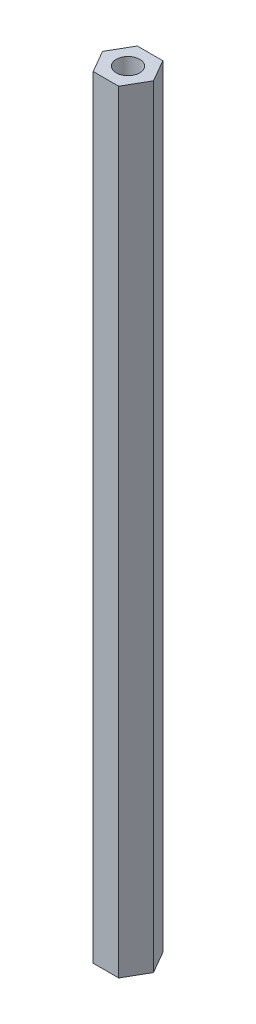
ISO-10303-21;
HEADER;
FILE_DESCRIPTION(('STEP AP214'),'2;1');
FILE_NAME('part.step','',(''),(''),'','','');
FILE_SCHEMA(('AUTOMOTIVE_DESIGN { 1 0 10303 214 1 1 1 1 }'));
ENDSEC;
DATA;
#1=APPLICATION_CONTEXT('core data for automotive mechanical design processes');
#2=APPLICATION_PROTOCOL_DEFINITION('international standard','automotive_design',2000,#1);
#3=PRODUCT_CONTEXT('',#1,'mechanical');
#4=PRODUCT('Part','Part','',(#3));
#5=PRODUCT_RELATED_PRODUCT_CATEGORY('part','',(#4));
#6=PRODUCT_DEFINITION_FORMATION('','',#4);
#7=PRODUCT_DEFINITION_CONTEXT('part definition',#1,'design');
#8=PRODUCT_DEFINITION('design','',#6,#7);
#9=PRODUCT_DEFINITION_SHAPE('','',#8);
#10=(LENGTH_UNIT() NAMED_UNIT(*) SI_UNIT(.MILLI.,.METRE.));
#11=(NAMED_UNIT(*) PLANE_ANGLE_UNIT() SI_UNIT($,.RADIAN.));
#12=(NAMED_UNIT(*) SI_UNIT($,.STERADIAN.) SOLID_ANGLE_UNIT());
#13=UNCERTAINTY_MEASURE_WITH_UNIT(LENGTH_MEASURE(1.E-05),#10,'distance_accuracy_value','');
#14=(GEOMETRIC_REPRESENTATION_CONTEXT(3) GLOBAL_UNCERTAINTY_ASSIGNED_CONTEXT((#13)) GLOBAL_UNIT_ASSIGNED_CONTEXT((#10,
#11,#12)) REPRESENTATION_CONTEXT('',''));
#15=CARTESIAN_POINT('',(0.,0.,0.));
#16=DIRECTION('',(0.,0.,1.));
#17=DIRECTION('',(1.,0.,0.));
#18=AXIS2_PLACEMENT_3D('',#15,#16,#17);
#19=CARTESIAN_POINT('',(0.,105.,0.));
#20=DIRECTION('',(0.,1.,0.));
#21=DIRECTION('',(0.,0.,1.));
#22=AXIS2_PLACEMENT_3D('',#19,#20,#21);
#23=PLANE('',#22);
#24=DIRECTION('',(0.5,0.,-0.866025403784439));
#25=VECTOR('',#24,1.);
#26=CARTESIAN_POINT('',(1.73205080756888,105.,3.));
#27=LINE('',#26,#25);
#28=CARTESIAN_POINT('',(1.73205080756888,105.,3.));
#29=VERTEX_POINT('',#28);
#30=CARTESIAN_POINT('',(3.46410161513775,105.,0.));
#31=VERTEX_POINT('',#30);
#32=EDGE_CURVE('E150',#29,#31,#27,.T.);
#33=ORIENTED_EDGE('',*,*,#32,.T.);
#34=DIRECTION('',(-0.500000000000001,0.,-0.866025403784438));
#35=VECTOR('',#34,1.);
#36=CARTESIAN_POINT('',(3.46410161513775,105.,0.));
#37=LINE('',#36,#35);
#38=CARTESIAN_POINT('',(1.73205080756888,105.,-3.));
#39=VERTEX_POINT('',#38);
#40=EDGE_CURVE('E98',#31,#39,#37,.T.);
#41=ORIENTED_EDGE('',*,*,#40,.T.);
#42=DIRECTION('',(-1.,0.,0.));
#43=VECTOR('',#42,1.);
#44=CARTESIAN_POINT('',(1.73205080756888,105.,-3.));
#45=LINE('',#44,#43);
#46=CARTESIAN_POINT('',(-1.73205080756888,105.,-3.));
#47=VERTEX_POINT('',#46);
#48=EDGE_CURVE('E111',#39,#47,#45,.T.);
#49=ORIENTED_EDGE('',*,*,#48,.T.);
#50=DIRECTION('',(-0.5,0.,0.866025403784439));
#51=VECTOR('',#50,1.);
#52=CARTESIAN_POINT('',(-1.73205080756888,105.,-3.));
#53=LINE('',#52,#51);
#54=CARTESIAN_POINT('',(-3.46410161513775,105.,0.));
#55=VERTEX_POINT('',#54);
#56=EDGE_CURVE('E105',#47,#55,#53,.T.);
#57=ORIENTED_EDGE('',*,*,#56,.T.);
#58=DIRECTION('',(0.5,0.,0.866025403784438));
#59=VECTOR('',#58,1.);
#60=CARTESIAN_POINT('',(-3.46410161513775,105.,0.));
#61=LINE('',#60,#59);
#62=CARTESIAN_POINT('',(-1.73205080756888,105.,3.));
#63=VERTEX_POINT('',#62);
#64=EDGE_CURVE('E109',#55,#63,#61,.T.);
#65=ORIENTED_EDGE('',*,*,#64,.T.);
#66=DIRECTION('',(1.,0.,0.));
#67=VECTOR('',#66,1.);
#68=CARTESIAN_POINT('',(-1.73205080756888,105.,3.));
#69=LINE('',#68,#67);
#70=EDGE_CURVE('E61',#63,#29,#69,.T.);
#71=ORIENTED_EDGE('',*,*,#70,.T.);
#72=EDGE_LOOP('',(#33,#41,#49,#57,#65,#71));
#73=FACE_BOUND('',#72,.T.);
#74=CARTESIAN_POINT('',(0.,105.,0.));
#75=DIRECTION('',(0.,1.,0.));
#76=DIRECTION('',(0.,0.,1.));
#77=AXIS2_PLACEMENT_3D('',#74,#75,#76);
#78=CIRCLE('',#77,1.6);
#79=CARTESIAN_POINT('',(0.,105.,1.6));
#80=VERTEX_POINT('',#79);
#81=EDGE_CURVE('E138',#80,#80,#78,.T.);
#82=ORIENTED_EDGE('',*,*,#81,.F.);
#83=EDGE_LOOP('',(#82));
#84=FACE_BOUND('',#83,.T.);
#85=ADVANCED_FACE('F43',(#73,#84),#23,.T.);
#86=CARTESIAN_POINT('',(0.,0.,0.));
#87=DIRECTION('',(0.,1.,0.));
#88=DIRECTION('',(0.,0.,1.));
#89=AXIS2_PLACEMENT_3D('',#86,#87,#88);
#90=PLANE('',#89);
#91=DIRECTION('',(0.5,0.,-0.866025403784439));
#92=VECTOR('',#91,1.);
#93=CARTESIAN_POINT('',(1.73205080756888,0.,3.));
#94=LINE('',#93,#92);
#95=CARTESIAN_POINT('',(1.73205080756888,0.,3.));
#96=VERTEX_POINT('',#95);
#97=CARTESIAN_POINT('',(3.46410161513775,0.,0.));
#98=VERTEX_POINT('',#97);
#99=EDGE_CURVE('E133',#96,#98,#94,.T.);
#100=ORIENTED_EDGE('',*,*,#99,.F.);
#101=DIRECTION('',(1.,0.,0.));
#102=VECTOR('',#101,1.);
#103=CARTESIAN_POINT('',(-1.73205080756888,0.,3.));
#104=LINE('',#103,#102);
#105=CARTESIAN_POINT('',(-1.73205080756888,0.,3.));
#106=VERTEX_POINT('',#105);
#107=EDGE_CURVE('E90',#106,#96,#104,.T.);
#108=ORIENTED_EDGE('',*,*,#107,.F.);
#109=DIRECTION('',(0.5,0.,0.866025403784438));
#110=VECTOR('',#109,1.);
#111=CARTESIAN_POINT('',(-3.46410161513775,0.,0.));
#112=LINE('',#111,#110);
#113=CARTESIAN_POINT('',(-3.46410161513775,0.,0.));
#114=VERTEX_POINT('',#113);
#115=EDGE_CURVE('E84',#114,#106,#112,.T.);
#116=ORIENTED_EDGE('',*,*,#115,.F.);
#117=DIRECTION('',(-0.5,0.,0.866025403784439));
#118=VECTOR('',#117,1.);
#119=CARTESIAN_POINT('',(-1.73205080756888,0.,-3.));
#120=LINE('',#119,#118);
#121=CARTESIAN_POINT('',(-1.73205080756888,0.,-3.));
#122=VERTEX_POINT('',#121);
#123=EDGE_CURVE('E120',#122,#114,#120,.T.);
#124=ORIENTED_EDGE('',*,*,#123,.F.);
#125=DIRECTION('',(-1.,0.,0.));
#126=VECTOR('',#125,1.);
#127=CARTESIAN_POINT('',(1.73205080756888,0.,-3.));
#128=LINE('',#127,#126);
#129=CARTESIAN_POINT('',(1.73205080756888,0.,-3.));
#130=VERTEX_POINT('',#129);
#131=EDGE_CURVE('E141',#130,#122,#128,.T.);
#132=ORIENTED_EDGE('',*,*,#131,.F.);
#133=DIRECTION('',(-0.500000000000001,0.,-0.866025403784438));
#134=VECTOR('',#133,1.);
#135=CARTESIAN_POINT('',(3.46410161513775,0.,0.));
#136=LINE('',#135,#134);
#137=EDGE_CURVE('E137',#98,#130,#136,.T.);
#138=ORIENTED_EDGE('',*,*,#137,.F.);
#139=EDGE_LOOP('',(#100,#108,#116,#124,#132,#138));
#140=FACE_BOUND('',#139,.T.);
#141=CARTESIAN_POINT('',(0.,0.,0.));
#142=DIRECTION('',(0.,1.,0.));
#143=DIRECTION('',(0.,0.,1.));
#144=AXIS2_PLACEMENT_3D('',#141,#142,#143);
#145=CIRCLE('',#144,1.6);
#146=CARTESIAN_POINT('',(0.,0.,1.6));
#147=VERTEX_POINT('',#146);
#148=EDGE_CURVE('E251',#147,#147,#145,.T.);
#149=ORIENTED_EDGE('',*,*,#148,.T.);
#150=EDGE_LOOP('',(#149));
#151=FACE_BOUND('',#150,.T.);
#152=ADVANCED_FACE('F163',(#140,#151),#90,.F.);
#153=CARTESIAN_POINT('',(1.73205080756888,105.,3.));
#154=DIRECTION('',(-0.866025403784439,0.,-0.5));
#155=DIRECTION('',(-0.5,0.,0.866025403784438));
#156=AXIS2_PLACEMENT_3D('',#153,#154,#155);
#157=PLANE('',#156);
#158=ORIENTED_EDGE('',*,*,#99,.T.);
#159=DIRECTION('',(0.,-1.,0.));
#160=VECTOR('',#159,1.);
#161=CARTESIAN_POINT('',(3.46410161513775,105.,0.));
#162=LINE('',#161,#160);
#163=EDGE_CURVE('E11',#31,#98,#162,.T.);
#164=ORIENTED_EDGE('',*,*,#163,.F.);
#165=ORIENTED_EDGE('',*,*,#32,.F.);
#166=DIRECTION('',(0.,-1.,0.));
#167=VECTOR('',#166,1.);
#168=CARTESIAN_POINT('',(1.73205080756888,105.,3.));
#169=LINE('',#168,#167);
#170=EDGE_CURVE('E129',#29,#96,#169,.T.);
#171=ORIENTED_EDGE('',*,*,#170,.T.);
#172=EDGE_LOOP('',(#158,#164,#165,#171));
#173=FACE_BOUND('',#172,.T.);
#174=ADVANCED_FACE('F45',(#173),#157,.F.);
#175=CARTESIAN_POINT('',(3.46410161513775,105.,0.));
#176=DIRECTION('',(-0.866025403784438,0.,0.500000000000001));
#177=DIRECTION('',(0.500000000000001,0.,0.866025403784438));
#178=AXIS2_PLACEMENT_3D('',#175,#176,#177);
#179=PLANE('',#178);
#180=ORIENTED_EDGE('',*,*,#137,.T.);
#181=DIRECTION('',(0.,-1.,0.));
#182=VECTOR('',#181,1.);
#183=CARTESIAN_POINT('',(1.73205080756888,105.,-3.));
#184=LINE('',#183,#182);
#185=EDGE_CURVE('E53',#39,#130,#184,.T.);
#186=ORIENTED_EDGE('',*,*,#185,.F.);
#187=ORIENTED_EDGE('',*,*,#40,.F.);
#188=ORIENTED_EDGE('',*,*,#163,.T.);
#189=EDGE_LOOP('',(#180,#186,#187,#188));
#190=FACE_BOUND('',#189,.T.);
#191=ADVANCED_FACE('F188',(#190),#179,.F.);
#192=CARTESIAN_POINT('',(1.73205080756888,105.,-3.));
#193=DIRECTION('',(0.,0.,1.));
#194=DIRECTION('',(1.,0.,0.));
#195=AXIS2_PLACEMENT_3D('',#192,#193,#194);
#196=PLANE('',#195);
#197=ORIENTED_EDGE('',*,*,#131,.T.);
#198=DIRECTION('',(0.,-1.,0.));
#199=VECTOR('',#198,1.);
#200=CARTESIAN_POINT('',(-1.73205080756888,105.,-3.));
#201=LINE('',#200,#199);
#202=EDGE_CURVE('E122',#47,#122,#201,.T.);
#203=ORIENTED_EDGE('',*,*,#202,.F.);
#204=ORIENTED_EDGE('',*,*,#48,.F.);
#205=ORIENTED_EDGE('',*,*,#185,.T.);
#206=EDGE_LOOP('',(#197,#203,#204,#205));
#207=FACE_BOUND('',#206,.T.);
#208=ADVANCED_FACE('F160',(#207),#196,.F.);
#209=CARTESIAN_POINT('',(-1.73205080756888,105.,-3.));
#210=DIRECTION('',(0.866025403784439,0.,0.5));
#211=DIRECTION('',(0.5,0.,-0.866025403784439));
#212=AXIS2_PLACEMENT_3D('',#209,#210,#211);
#213=PLANE('',#212);
#214=ORIENTED_EDGE('',*,*,#123,.T.);
#215=DIRECTION('',(0.,-1.,0.));
#216=VECTOR('',#215,1.);
#217=CARTESIAN_POINT('',(-3.46410161513775,105.,0.));
#218=LINE('',#217,#216);
#219=EDGE_CURVE('E117',#55,#114,#218,.T.);
#220=ORIENTED_EDGE('',*,*,#219,.F.);
#221=ORIENTED_EDGE('',*,*,#56,.F.);
#222=ORIENTED_EDGE('',*,*,#202,.T.);
#223=EDGE_LOOP('',(#214,#220,#221,#222));
#224=FACE_BOUND('',#223,.T.);
#225=ADVANCED_FACE('F118',(#224),#213,.F.);
#226=CARTESIAN_POINT('',(-3.46410161513775,105.,0.));
#227=DIRECTION('',(0.866025403784439,0.,-0.5));
#228=DIRECTION('',(-0.5,0.,-0.866025403784439));
#229=AXIS2_PLACEMENT_3D('',#226,#227,#228);
#230=PLANE('',#229);
#231=ORIENTED_EDGE('',*,*,#115,.T.);
#232=DIRECTION('',(0.,-1.,0.));
#233=VECTOR('',#232,1.);
#234=CARTESIAN_POINT('',(-1.73205080756888,105.,3.));
#235=LINE('',#234,#233);
#236=EDGE_CURVE('E123',#63,#106,#235,.T.);
#237=ORIENTED_EDGE('',*,*,#236,.F.);
#238=ORIENTED_EDGE('',*,*,#64,.F.);
#239=ORIENTED_EDGE('',*,*,#219,.T.);
#240=EDGE_LOOP('',(#231,#237,#238,#239));
#241=FACE_BOUND('',#240,.T.);
#242=ADVANCED_FACE('F125',(#241),#230,.F.);
#243=CARTESIAN_POINT('',(-1.73205080756888,105.,3.));
#244=DIRECTION('',(0.,0.,-1.));
#245=DIRECTION('',(-1.,0.,0.));
#246=AXIS2_PLACEMENT_3D('',#243,#244,#245);
#247=PLANE('',#246);
#248=ORIENTED_EDGE('',*,*,#107,.T.);
#249=ORIENTED_EDGE('',*,*,#170,.F.);
#250=ORIENTED_EDGE('',*,*,#70,.F.);
#251=ORIENTED_EDGE('',*,*,#236,.T.);
#252=EDGE_LOOP('',(#248,#249,#250,#251));
#253=FACE_BOUND('',#252,.T.);
#254=ADVANCED_FACE('F168',(#253),#247,.F.);
#255=CARTESIAN_POINT('',(0.,105.,0.));
#256=DIRECTION('',(0.,-1.,0.));
#257=DIRECTION('',(0.,0.,-1.));
#258=AXIS2_PLACEMENT_3D('',#255,#256,#257);
#259=CYLINDRICAL_SURFACE('',#258,1.6);
#260=ORIENTED_EDGE('',*,*,#81,.T.);
#261=EDGE_LOOP('',(#260));
#262=FACE_BOUND('',#261,.T.);
#263=ORIENTED_EDGE('',*,*,#148,.F.);
#264=EDGE_LOOP('',(#263));
#265=FACE_BOUND('',#264,.T.);
#266=ADVANCED_FACE('F170',(#262,#265),#259,.F.);
#267=CLOSED_SHELL('',(#85,#152,#174,#191,#208,#225,#242,#254,#266));
#268=MANIFOLD_SOLID_BREP('B2',#267);
#269=ADVANCED_BREP_SHAPE_REPRESENTATION('',(#18,#268),#14);
#270=SHAPE_DEFINITION_REPRESENTATION(#9,#269);
ENDSEC;
END-ISO-10303-21;
